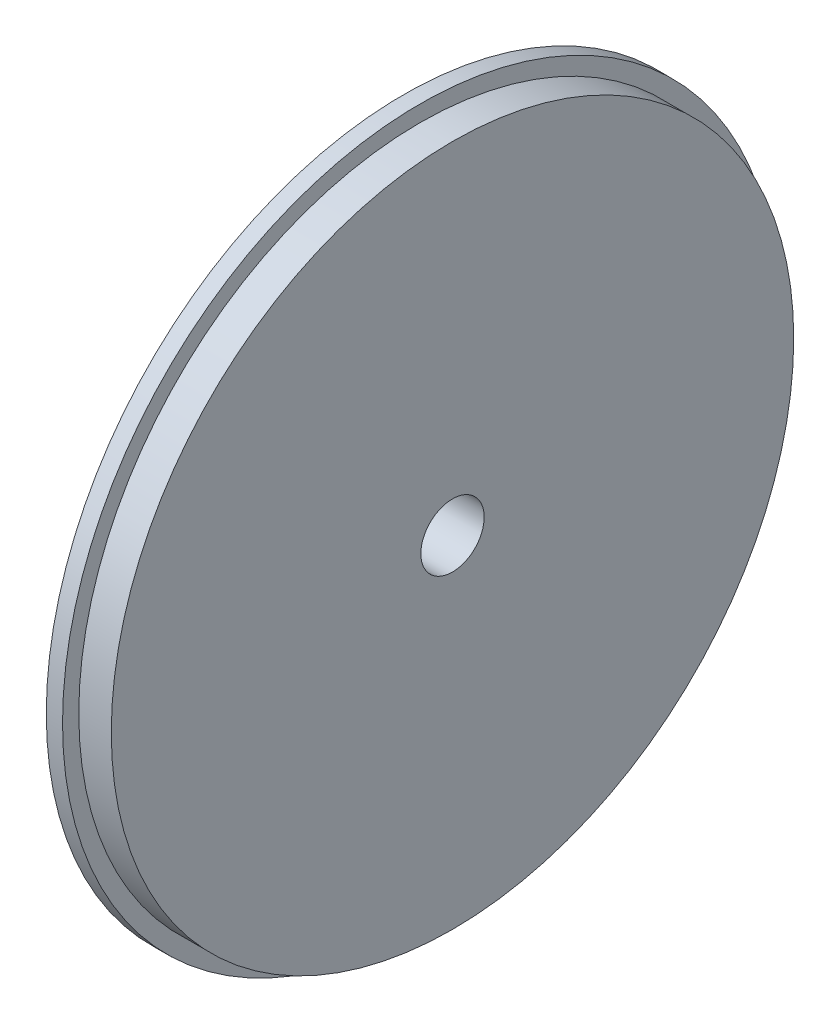
ISO-10303-21;
HEADER;
FILE_DESCRIPTION(('STEP AP214'),'2;1');
FILE_NAME('part.step','',(''),(''),'','','');
FILE_SCHEMA(('AUTOMOTIVE_DESIGN { 1 0 10303 214 1 1 1 1 }'));
ENDSEC;
DATA;
#1=APPLICATION_CONTEXT('core data for automotive mechanical design processes');
#2=APPLICATION_PROTOCOL_DEFINITION('international standard','automotive_design',2000,#1);
#3=PRODUCT_CONTEXT('',#1,'mechanical');
#4=PRODUCT('Part','Part','',(#3));
#5=PRODUCT_RELATED_PRODUCT_CATEGORY('part','',(#4));
#6=PRODUCT_DEFINITION_FORMATION('','',#4);
#7=PRODUCT_DEFINITION_CONTEXT('part definition',#1,'design');
#8=PRODUCT_DEFINITION('design','',#6,#7);
#9=PRODUCT_DEFINITION_SHAPE('','',#8);
#10=(LENGTH_UNIT() NAMED_UNIT(*) SI_UNIT(.MILLI.,.METRE.));
#11=(NAMED_UNIT(*) PLANE_ANGLE_UNIT() SI_UNIT($,.RADIAN.));
#12=(NAMED_UNIT(*) SI_UNIT($,.STERADIAN.) SOLID_ANGLE_UNIT());
#13=UNCERTAINTY_MEASURE_WITH_UNIT(LENGTH_MEASURE(1.E-05),#10,'distance_accuracy_value','');
#14=(GEOMETRIC_REPRESENTATION_CONTEXT(3) GLOBAL_UNCERTAINTY_ASSIGNED_CONTEXT((#13)) GLOBAL_UNIT_ASSIGNED_CONTEXT((#10,
#11,#12)) REPRESENTATION_CONTEXT('',''));
#15=CARTESIAN_POINT('',(0.,0.,0.));
#16=DIRECTION('',(0.,0.,1.));
#17=DIRECTION('',(1.,0.,0.));
#18=AXIS2_PLACEMENT_3D('',#15,#16,#17);
#19=CARTESIAN_POINT('',(-0.750000000000001,0.975,0.));
#20=DIRECTION('',(1.,0.,0.));
#21=DIRECTION('',(0.,0.,-1.));
#22=AXIS2_PLACEMENT_3D('',#19,#20,#21);
#23=PLANE('',#22);
#24=CARTESIAN_POINT('',(-0.75,0.,0.));
#25=DIRECTION('',(-1.,0.,0.));
#26=DIRECTION('',(0.,0.,1.));
#27=AXIS2_PLACEMENT_3D('',#24,#25,#26);
#28=CIRCLE('',#27,0.975);
#29=CARTESIAN_POINT('',(-0.75,0.,0.975));
#30=VERTEX_POINT('',#29);
#31=EDGE_CURVE('E64',#30,#30,#28,.T.);
#32=ORIENTED_EDGE('',*,*,#31,.F.);
#33=EDGE_LOOP('',(#32));
#34=FACE_BOUND('',#33,.T.);
#35=CARTESIAN_POINT('',(-0.750000000000001,0.,0.));
#36=DIRECTION('',(-1.,0.,0.));
#37=DIRECTION('',(0.,0.,1.));
#38=AXIS2_PLACEMENT_3D('',#35,#36,#37);
#39=CIRCLE('',#38,11.);
#40=CARTESIAN_POINT('',(-0.750000000000001,0.,11.));
#41=VERTEX_POINT('',#40);
#42=EDGE_CURVE('E10',#41,#41,#39,.T.);
#43=ORIENTED_EDGE('',*,*,#42,.T.);
#44=EDGE_LOOP('',(#43));
#45=FACE_BOUND('',#44,.T.);
#46=ADVANCED_FACE('F37',(#34,#45),#23,.F.);
#47=CARTESIAN_POINT('',(-0.75,0.,0.));
#48=DIRECTION('',(-1.,0.,0.));
#49=DIRECTION('',(0.,0.,1.));
#50=AXIS2_PLACEMENT_3D('',#47,#48,#49);
#51=CYLINDRICAL_SURFACE('',#50,11.);
#52=ORIENTED_EDGE('',*,*,#42,.F.);
#53=EDGE_LOOP('',(#52));
#54=FACE_BOUND('',#53,.T.);
#55=CARTESIAN_POINT('',(-0.25,0.,0.));
#56=DIRECTION('',(-1.,0.,0.));
#57=DIRECTION('',(0.,0.,1.));
#58=AXIS2_PLACEMENT_3D('',#55,#56,#57);
#59=CIRCLE('',#58,11.);
#60=CARTESIAN_POINT('',(-0.25,0.,11.));
#61=VERTEX_POINT('',#60);
#62=EDGE_CURVE('E44',#61,#61,#59,.T.);
#63=ORIENTED_EDGE('',*,*,#62,.T.);
#64=EDGE_LOOP('',(#63));
#65=FACE_BOUND('',#64,.T.);
#66=ADVANCED_FACE('F72',(#54,#65),#51,.T.);
#67=CARTESIAN_POINT('',(-0.25,11.,0.));
#68=DIRECTION('',(-1.,0.,0.));
#69=DIRECTION('',(0.,0.,1.));
#70=AXIS2_PLACEMENT_3D('',#67,#68,#69);
#71=PLANE('',#70);
#72=ORIENTED_EDGE('',*,*,#62,.F.);
#73=EDGE_LOOP('',(#72));
#74=FACE_BOUND('',#73,.T.);
#75=CARTESIAN_POINT('',(-0.25,0.,0.));
#76=DIRECTION('',(-1.,0.,0.));
#77=DIRECTION('',(0.,0.,1.));
#78=AXIS2_PLACEMENT_3D('',#75,#76,#77);
#79=CIRCLE('',#78,10.5);
#80=CARTESIAN_POINT('',(-0.25,0.,10.5));
#81=VERTEX_POINT('',#80);
#82=EDGE_CURVE('E49',#81,#81,#79,.T.);
#83=ORIENTED_EDGE('',*,*,#82,.T.);
#84=EDGE_LOOP('',(#83));
#85=FACE_BOUND('',#84,.T.);
#86=ADVANCED_FACE('F76',(#74,#85),#71,.F.);
#87=CARTESIAN_POINT('',(-0.75,0.,0.));
#88=DIRECTION('',(-1.,0.,0.));
#89=DIRECTION('',(0.,0.,1.));
#90=AXIS2_PLACEMENT_3D('',#87,#88,#89);
#91=CYLINDRICAL_SURFACE('',#90,10.5);
#92=ORIENTED_EDGE('',*,*,#82,.F.);
#93=EDGE_LOOP('',(#92));
#94=FACE_BOUND('',#93,.T.);
#95=CARTESIAN_POINT('',(0.750000000000003,0.,0.));
#96=DIRECTION('',(-1.,0.,0.));
#97=DIRECTION('',(0.,0.,1.));
#98=AXIS2_PLACEMENT_3D('',#95,#96,#97);
#99=CIRCLE('',#98,10.5);
#100=CARTESIAN_POINT('',(0.750000000000003,0.,10.5));
#101=VERTEX_POINT('',#100);
#102=EDGE_CURVE('E54',#101,#101,#99,.T.);
#103=ORIENTED_EDGE('',*,*,#102,.T.);
#104=EDGE_LOOP('',(#103));
#105=FACE_BOUND('',#104,.T.);
#106=ADVANCED_FACE('F81',(#94,#105),#91,.T.);
#107=CARTESIAN_POINT('',(0.750000000000001,0.975,0.));
#108=DIRECTION('',(-1.,0.,0.));
#109=DIRECTION('',(0.,0.,1.));
#110=AXIS2_PLACEMENT_3D('',#107,#108,#109);
#111=PLANE('',#110);
#112=ORIENTED_EDGE('',*,*,#102,.F.);
#113=EDGE_LOOP('',(#112));
#114=FACE_BOUND('',#113,.T.);
#115=CARTESIAN_POINT('',(0.75,0.,0.));
#116=DIRECTION('',(-1.,0.,0.));
#117=DIRECTION('',(0.,0.,1.));
#118=AXIS2_PLACEMENT_3D('',#115,#116,#117);
#119=CIRCLE('',#118,0.975);
#120=CARTESIAN_POINT('',(0.75,0.,0.975));
#121=VERTEX_POINT('',#120);
#122=EDGE_CURVE('E60',#121,#121,#119,.T.);
#123=ORIENTED_EDGE('',*,*,#122,.T.);
#124=EDGE_LOOP('',(#123));
#125=FACE_BOUND('',#124,.T.);
#126=ADVANCED_FACE('F87',(#114,#125),#111,.F.);
#127=CARTESIAN_POINT('',(-0.75,0.,0.));
#128=DIRECTION('',(-1.,0.,0.));
#129=DIRECTION('',(0.,0.,1.));
#130=AXIS2_PLACEMENT_3D('',#127,#128,#129);
#131=CYLINDRICAL_SURFACE('',#130,0.975);
#132=ORIENTED_EDGE('',*,*,#122,.F.);
#133=EDGE_LOOP('',(#132));
#134=FACE_BOUND('',#133,.T.);
#135=ORIENTED_EDGE('',*,*,#31,.T.);
#136=EDGE_LOOP('',(#135));
#137=FACE_BOUND('',#136,.T.);
#138=ADVANCED_FACE('F69',(#134,#137),#131,.F.);
#139=CLOSED_SHELL('',(#46,#66,#86,#106,#126,#138));
#140=MANIFOLD_SOLID_BREP('B2',#139);
#141=ADVANCED_BREP_SHAPE_REPRESENTATION('',(#18,#140),#14);
#142=SHAPE_DEFINITION_REPRESENTATION(#9,#141);
ENDSEC;
END-ISO-10303-21;
